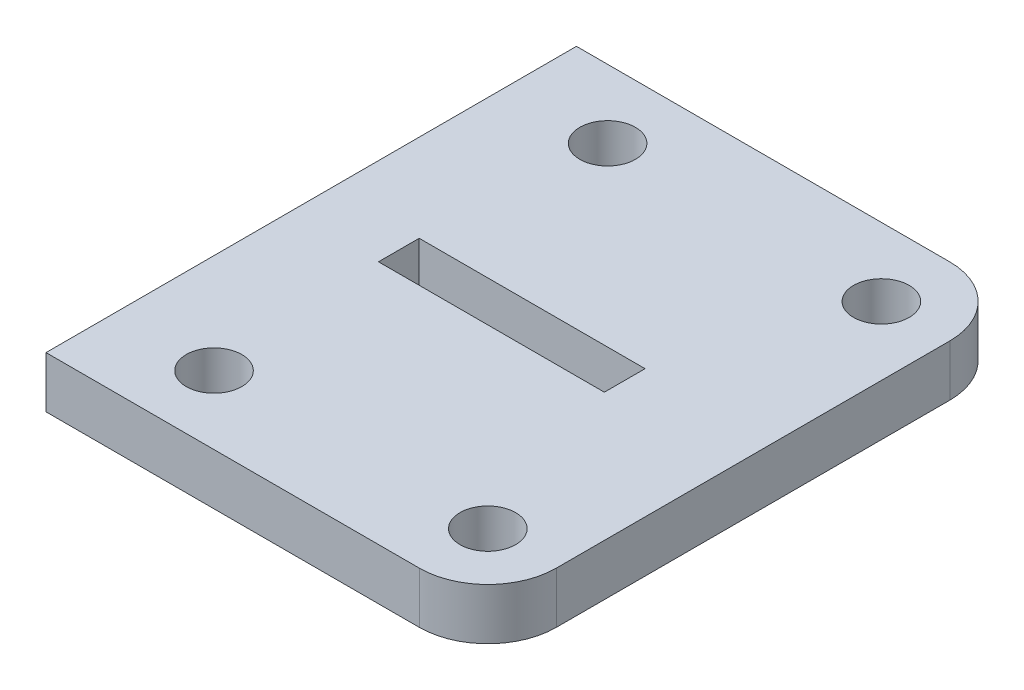
ISO-10303-21;
HEADER;
FILE_DESCRIPTION(('STEP AP214'),'2;1');
FILE_NAME('part.step','',(''),(''),'','','');
FILE_SCHEMA(('AUTOMOTIVE_DESIGN { 1 0 10303 214 1 1 1 1 }'));
ENDSEC;
DATA;
#1=APPLICATION_CONTEXT('core data for automotive mechanical design processes');
#2=APPLICATION_PROTOCOL_DEFINITION('international standard','automotive_design',2000,#1);
#3=PRODUCT_CONTEXT('',#1,'mechanical');
#4=PRODUCT('Part','Part','',(#3));
#5=PRODUCT_RELATED_PRODUCT_CATEGORY('part','',(#4));
#6=PRODUCT_DEFINITION_FORMATION('','',#4);
#7=PRODUCT_DEFINITION_CONTEXT('part definition',#1,'design');
#8=PRODUCT_DEFINITION('design','',#6,#7);
#9=PRODUCT_DEFINITION_SHAPE('','',#8);
#10=(LENGTH_UNIT() NAMED_UNIT(*) SI_UNIT(.MILLI.,.METRE.));
#11=(NAMED_UNIT(*) PLANE_ANGLE_UNIT() SI_UNIT($,.RADIAN.));
#12=(NAMED_UNIT(*) SI_UNIT($,.STERADIAN.) SOLID_ANGLE_UNIT());
#13=UNCERTAINTY_MEASURE_WITH_UNIT(LENGTH_MEASURE(1.E-05),#10,'distance_accuracy_value','');
#14=(GEOMETRIC_REPRESENTATION_CONTEXT(3) GLOBAL_UNCERTAINTY_ASSIGNED_CONTEXT((#13)) GLOBAL_UNIT_ASSIGNED_CONTEXT((#10,
#11,#12)) REPRESENTATION_CONTEXT('',''));
#15=CARTESIAN_POINT('',(0.,0.,0.));
#16=DIRECTION('',(0.,0.,1.));
#17=DIRECTION('',(1.,0.,0.));
#18=AXIS2_PLACEMENT_3D('',#15,#16,#17);
#19=CARTESIAN_POINT('',(60.,0.,30.));
#20=DIRECTION('',(0.,1.,0.));
#21=DIRECTION('',(-1.,0.,0.));
#22=AXIS2_PLACEMENT_3D('',#19,#20,#21);
#23=PLANE('',#22);
#24=DIRECTION('',(-1.,0.,0.));
#25=VECTOR('',#24,1.);
#26=CARTESIAN_POINT('',(15.,0.,12.62));
#27=LINE('',#26,#25);
#28=CARTESIAN_POINT('',(41.4,0.,12.62));
#29=VERTEX_POINT('',#28);
#30=CARTESIAN_POINT('',(15.,0.,12.62));
#31=VERTEX_POINT('',#30);
#32=EDGE_CURVE('E184',#29,#31,#27,.T.);
#33=ORIENTED_EDGE('',*,*,#32,.T.);
#34=DIRECTION('',(0.,0.,1.));
#35=VECTOR('',#34,1.);
#36=CARTESIAN_POINT('',(15.,0.,12.62));
#37=LINE('',#36,#35);
#38=CARTESIAN_POINT('',(15.,0.,17.38));
#39=VERTEX_POINT('',#38);
#40=EDGE_CURVE('E173',#31,#39,#37,.T.);
#41=ORIENTED_EDGE('',*,*,#40,.T.);
#42=DIRECTION('',(1.,0.,0.));
#43=VECTOR('',#42,1.);
#44=CARTESIAN_POINT('',(15.,0.,17.38));
#45=LINE('',#44,#43);
#46=CARTESIAN_POINT('',(41.4,0.,17.38));
#47=VERTEX_POINT('',#46);
#48=EDGE_CURVE('E177',#39,#47,#45,.T.);
#49=ORIENTED_EDGE('',*,*,#48,.T.);
#50=DIRECTION('',(0.,0.,-1.));
#51=VECTOR('',#50,1.);
#52=CARTESIAN_POINT('',(41.4,0.,12.62));
#53=LINE('',#52,#51);
#54=EDGE_CURVE('E69',#47,#29,#53,.T.);
#55=ORIENTED_EDGE('',*,*,#54,.T.);
#56=EDGE_LOOP('',(#33,#41,#49,#55));
#57=FACE_BOUND('',#56,.T.);
#58=CARTESIAN_POINT('',(16.4,0.,-8.));
#59=DIRECTION('',(0.,1.,0.));
#60=DIRECTION('',(0.,0.,1.));
#61=AXIS2_PLACEMENT_3D('',#58,#59,#60);
#62=CIRCLE('',#61,3.25);
#63=CARTESIAN_POINT('',(16.4,0.,-4.75));
#64=VERTEX_POINT('',#63);
#65=EDGE_CURVE('E206',#64,#64,#62,.T.);
#66=ORIENTED_EDGE('',*,*,#65,.T.);
#67=EDGE_LOOP('',(#66));
#68=FACE_BOUND('',#67,.T.);
#69=CARTESIAN_POINT('',(16.4,0.,38.));
#70=DIRECTION('',(0.,1.,0.));
#71=DIRECTION('',(0.,0.,1.));
#72=AXIS2_PLACEMENT_3D('',#69,#70,#71);
#73=CIRCLE('',#72,3.25);
#74=CARTESIAN_POINT('',(16.4,0.,41.25));
#75=VERTEX_POINT('',#74);
#76=EDGE_CURVE('E232',#75,#75,#73,.T.);
#77=ORIENTED_EDGE('',*,*,#76,.T.);
#78=EDGE_LOOP('',(#77));
#79=FACE_BOUND('',#78,.T.);
#80=CARTESIAN_POINT('',(48.4,0.,38.));
#81=DIRECTION('',(0.,1.,0.));
#82=DIRECTION('',(0.,0.,1.));
#83=AXIS2_PLACEMENT_3D('',#80,#81,#82);
#84=CIRCLE('',#83,3.25);
#85=CARTESIAN_POINT('',(48.4,0.,41.25));
#86=VERTEX_POINT('',#85);
#87=EDGE_CURVE('E221',#86,#86,#84,.T.);
#88=ORIENTED_EDGE('',*,*,#87,.T.);
#89=EDGE_LOOP('',(#88));
#90=FACE_BOUND('',#89,.T.);
#91=CARTESIAN_POINT('',(48.4,0.,-8.));
#92=DIRECTION('',(0.,1.,0.));
#93=DIRECTION('',(0.,0.,1.));
#94=AXIS2_PLACEMENT_3D('',#91,#92,#93);
#95=CIRCLE('',#94,3.25);
#96=CARTESIAN_POINT('',(48.4,0.,-4.75));
#97=VERTEX_POINT('',#96);
#98=EDGE_CURVE('E145',#97,#97,#95,.T.);
#99=ORIENTED_EDGE('',*,*,#98,.T.);
#100=EDGE_LOOP('',(#99));
#101=FACE_BOUND('',#100,.T.);
#102=DIRECTION('',(1.,0.,0.));
#103=VECTOR('',#102,1.);
#104=CARTESIAN_POINT('',(56.4,0.,46.));
#105=LINE('',#104,#103);
#106=CARTESIAN_POINT('',(4.76,0.,46.));
#107=VERTEX_POINT('',#106);
#108=CARTESIAN_POINT('',(48.4,0.,46.));
#109=VERTEX_POINT('',#108);
#110=EDGE_CURVE('E136',#107,#109,#105,.T.);
#111=ORIENTED_EDGE('',*,*,#110,.F.);
#112=DIRECTION('',(0.,0.,-1.));
#113=VECTOR('',#112,1.);
#114=CARTESIAN_POINT('',(4.75999999999999,0.,-16.));
#115=LINE('',#114,#113);
#116=CARTESIAN_POINT('',(4.75999999999999,0.,-16.));
#117=VERTEX_POINT('',#116);
#118=EDGE_CURVE('E123',#107,#117,#115,.T.);
#119=ORIENTED_EDGE('',*,*,#118,.T.);
#120=DIRECTION('',(-1.,0.,0.));
#121=VECTOR('',#120,1.);
#122=CARTESIAN_POINT('',(56.4,0.,-16.));
#123=LINE('',#122,#121);
#124=CARTESIAN_POINT('',(48.4,0.,-16.));
#125=VERTEX_POINT('',#124);
#126=EDGE_CURVE('E134',#125,#117,#123,.T.);
#127=ORIENTED_EDGE('',*,*,#126,.F.);
#128=CARTESIAN_POINT('',(48.4,0.,-8.));
#129=DIRECTION('',(0.,1.,0.));
#130=DIRECTION('',(-1.,0.,0.));
#131=AXIS2_PLACEMENT_3D('',#128,#129,#130);
#132=CIRCLE('',#131,8.);
#133=CARTESIAN_POINT('',(56.4,0.,-8.));
#134=VERTEX_POINT('',#133);
#135=EDGE_CURVE('E320',#125,#134,#132,.F.);
#136=ORIENTED_EDGE('',*,*,#135,.T.);
#137=DIRECTION('',(0.,0.,1.));
#138=VECTOR('',#137,1.);
#139=CARTESIAN_POINT('',(56.4,0.,0.));
#140=LINE('',#139,#138);
#141=CARTESIAN_POINT('',(56.4,0.,38.));
#142=VERTEX_POINT('',#141);
#143=EDGE_CURVE('E328',#134,#142,#140,.T.);
#144=ORIENTED_EDGE('',*,*,#143,.T.);
#145=CARTESIAN_POINT('',(48.4,0.,38.));
#146=DIRECTION('',(0.,1.,0.));
#147=DIRECTION('',(-1.,0.,0.));
#148=AXIS2_PLACEMENT_3D('',#145,#146,#147);
#149=CIRCLE('',#148,8.);
#150=EDGE_CURVE('E323',#142,#109,#149,.F.);
#151=ORIENTED_EDGE('',*,*,#150,.T.);
#152=EDGE_LOOP('',(#111,#119,#127,#136,#144,#151));
#153=FACE_BOUND('',#152,.T.);
#154=ADVANCED_FACE('F45',(#57,#68,#79,#90,#101,#153),#23,.F.);
#155=CARTESIAN_POINT('',(60.,6.,18.));
#156=DIRECTION('',(0.,-1.,0.));
#157=DIRECTION('',(0.,0.,-1.));
#158=AXIS2_PLACEMENT_3D('',#155,#156,#157);
#159=PLANE('',#158);
#160=DIRECTION('',(1.,0.,0.));
#161=VECTOR('',#160,1.);
#162=CARTESIAN_POINT('',(15.,6.,17.38));
#163=LINE('',#162,#161);
#164=CARTESIAN_POINT('',(15.,6.,17.38));
#165=VERTEX_POINT('',#164);
#166=CARTESIAN_POINT('',(41.4,6.,17.38));
#167=VERTEX_POINT('',#166);
#168=EDGE_CURVE('E192',#165,#167,#163,.T.);
#169=ORIENTED_EDGE('',*,*,#168,.F.);
#170=DIRECTION('',(0.,0.,1.));
#171=VECTOR('',#170,1.);
#172=CARTESIAN_POINT('',(15.,6.,12.62));
#173=LINE('',#172,#171);
#174=CARTESIAN_POINT('',(15.,6.,12.62));
#175=VERTEX_POINT('',#174);
#176=EDGE_CURVE('E171',#175,#165,#173,.T.);
#177=ORIENTED_EDGE('',*,*,#176,.F.);
#178=DIRECTION('',(-1.,0.,0.));
#179=VECTOR('',#178,1.);
#180=CARTESIAN_POINT('',(15.,6.,12.62));
#181=LINE('',#180,#179);
#182=CARTESIAN_POINT('',(41.4,6.,12.62));
#183=VERTEX_POINT('',#182);
#184=EDGE_CURVE('E178',#183,#175,#181,.T.);
#185=ORIENTED_EDGE('',*,*,#184,.F.);
#186=DIRECTION('',(0.,0.,-1.));
#187=VECTOR('',#186,1.);
#188=CARTESIAN_POINT('',(41.4,6.,12.62));
#189=LINE('',#188,#187);
#190=EDGE_CURVE('E201',#167,#183,#189,.T.);
#191=ORIENTED_EDGE('',*,*,#190,.F.);
#192=EDGE_LOOP('',(#169,#177,#185,#191));
#193=FACE_BOUND('',#192,.T.);
#194=DIRECTION('',(1.,0.,0.));
#195=VECTOR('',#194,1.);
#196=CARTESIAN_POINT('',(56.4,6.,-16.));
#197=LINE('',#196,#195);
#198=CARTESIAN_POINT('',(4.76,6.,-16.));
#199=VERTEX_POINT('',#198);
#200=CARTESIAN_POINT('',(48.4,6.,-16.));
#201=VERTEX_POINT('',#200);
#202=EDGE_CURVE('E144',#199,#201,#197,.T.);
#203=ORIENTED_EDGE('',*,*,#202,.F.);
#204=DIRECTION('',(0.,0.,-1.));
#205=VECTOR('',#204,1.);
#206=CARTESIAN_POINT('',(4.75999999999999,6.,-16.));
#207=LINE('',#206,#205);
#208=CARTESIAN_POINT('',(4.76,6.,46.));
#209=VERTEX_POINT('',#208);
#210=EDGE_CURVE('E61',#209,#199,#207,.T.);
#211=ORIENTED_EDGE('',*,*,#210,.F.);
#212=DIRECTION('',(-1.,0.,0.));
#213=VECTOR('',#212,1.);
#214=CARTESIAN_POINT('',(56.4,6.,46.));
#215=LINE('',#214,#213);
#216=CARTESIAN_POINT('',(48.4,6.,46.));
#217=VERTEX_POINT('',#216);
#218=EDGE_CURVE('E149',#217,#209,#215,.T.);
#219=ORIENTED_EDGE('',*,*,#218,.F.);
#220=CARTESIAN_POINT('',(48.4,6.,38.));
#221=DIRECTION('',(0.,-1.,0.));
#222=DIRECTION('',(0.,0.,-1.));
#223=AXIS2_PLACEMENT_3D('',#220,#221,#222);
#224=CIRCLE('',#223,8.);
#225=CARTESIAN_POINT('',(56.4,6.00000000000001,38.));
#226=VERTEX_POINT('',#225);
#227=EDGE_CURVE('E12',#217,#226,#224,.F.);
#228=ORIENTED_EDGE('',*,*,#227,.T.);
#229=DIRECTION('',(0.,0.,1.));
#230=VECTOR('',#229,1.);
#231=CARTESIAN_POINT('',(56.4,6.,0.));
#232=LINE('',#231,#230);
#233=CARTESIAN_POINT('',(56.4,5.99999999999999,-8.));
#234=VERTEX_POINT('',#233);
#235=EDGE_CURVE('E329',#234,#226,#232,.T.);
#236=ORIENTED_EDGE('',*,*,#235,.F.);
#237=CARTESIAN_POINT('',(48.4,6.,-8.));
#238=DIRECTION('',(0.,-1.,0.));
#239=DIRECTION('',(0.,0.,-1.));
#240=AXIS2_PLACEMENT_3D('',#237,#238,#239);
#241=CIRCLE('',#240,8.);
#242=EDGE_CURVE('E306',#234,#201,#241,.F.);
#243=ORIENTED_EDGE('',*,*,#242,.T.);
#244=EDGE_LOOP('',(#203,#211,#219,#228,#236,#243));
#245=FACE_BOUND('',#244,.T.);
#246=CARTESIAN_POINT('',(16.4,6.,38.));
#247=DIRECTION('',(0.,1.,0.));
#248=DIRECTION('',(0.,0.,1.));
#249=AXIS2_PLACEMENT_3D('',#246,#247,#248);
#250=CIRCLE('',#249,3.25);
#251=CARTESIAN_POINT('',(16.4,6.,41.25));
#252=VERTEX_POINT('',#251);
#253=EDGE_CURVE('E260',#252,#252,#250,.T.);
#254=ORIENTED_EDGE('',*,*,#253,.F.);
#255=EDGE_LOOP('',(#254));
#256=FACE_BOUND('',#255,.T.);
#257=CARTESIAN_POINT('',(48.4,6.,38.));
#258=DIRECTION('',(0.,1.,0.));
#259=DIRECTION('',(0.,0.,1.));
#260=AXIS2_PLACEMENT_3D('',#257,#258,#259);
#261=CIRCLE('',#260,3.25);
#262=CARTESIAN_POINT('',(48.4,6.,41.25));
#263=VERTEX_POINT('',#262);
#264=EDGE_CURVE('E216',#263,#263,#261,.T.);
#265=ORIENTED_EDGE('',*,*,#264,.F.);
#266=EDGE_LOOP('',(#265));
#267=FACE_BOUND('',#266,.T.);
#268=CARTESIAN_POINT('',(16.4,6.,-8.));
#269=DIRECTION('',(0.,1.,0.));
#270=DIRECTION('',(0.,0.,1.));
#271=AXIS2_PLACEMENT_3D('',#268,#269,#270);
#272=CIRCLE('',#271,3.25);
#273=CARTESIAN_POINT('',(16.4,6.,-4.75));
#274=VERTEX_POINT('',#273);
#275=EDGE_CURVE('E226',#274,#274,#272,.T.);
#276=ORIENTED_EDGE('',*,*,#275,.F.);
#277=EDGE_LOOP('',(#276));
#278=FACE_BOUND('',#277,.T.);
#279=CARTESIAN_POINT('',(48.4,6.,-8.));
#280=DIRECTION('',(0.,1.,0.));
#281=DIRECTION('',(0.,0.,1.));
#282=AXIS2_PLACEMENT_3D('',#279,#280,#281);
#283=CIRCLE('',#282,3.25);
#284=CARTESIAN_POINT('',(48.4,6.,-4.75));
#285=VERTEX_POINT('',#284);
#286=EDGE_CURVE('E152',#285,#285,#283,.T.);
#287=ORIENTED_EDGE('',*,*,#286,.F.);
#288=EDGE_LOOP('',(#287));
#289=FACE_BOUND('',#288,.T.);
#290=ADVANCED_FACE('F247',(#193,#245,#256,#267,#278,#289),#159,.F.);
#291=CARTESIAN_POINT('',(56.4,0.,0.));
#292=DIRECTION('',(-1.,0.,0.));
#293=DIRECTION('',(0.,0.,1.));
#294=AXIS2_PLACEMENT_3D('',#291,#292,#293);
#295=PLANE('',#294);
#296=ORIENTED_EDGE('',*,*,#143,.F.);
#297=DIRECTION('',(0.,-1.,0.));
#298=VECTOR('',#297,1.);
#299=CARTESIAN_POINT('',(56.4,6.,-8.));
#300=LINE('',#299,#298);
#301=EDGE_CURVE('E308',#134,#234,#300,.F.);
#302=ORIENTED_EDGE('',*,*,#301,.T.);
#303=ORIENTED_EDGE('',*,*,#235,.T.);
#304=DIRECTION('',(0.,1.,0.));
#305=VECTOR('',#304,1.);
#306=CARTESIAN_POINT('',(56.4,0.,38.));
#307=LINE('',#306,#305);
#308=EDGE_CURVE('E315',#226,#142,#307,.F.);
#309=ORIENTED_EDGE('',*,*,#308,.T.);
#310=EDGE_LOOP('',(#296,#302,#303,#309));
#311=FACE_BOUND('',#310,.T.);
#312=ADVANCED_FACE('F250',(#311),#295,.F.);
#313=CARTESIAN_POINT('',(0.,0.,46.));
#314=DIRECTION('',(0.,0.,-1.));
#315=DIRECTION('',(-1.,0.,0.));
#316=AXIS2_PLACEMENT_3D('',#313,#314,#315);
#317=PLANE('',#316);
#318=ORIENTED_EDGE('',*,*,#218,.T.);
#319=DIRECTION('',(0.,1.,0.));
#320=VECTOR('',#319,1.);
#321=CARTESIAN_POINT('',(4.76,0.,46.));
#322=LINE('',#321,#320);
#323=EDGE_CURVE('E129',#107,#209,#322,.T.);
#324=ORIENTED_EDGE('',*,*,#323,.F.);
#325=ORIENTED_EDGE('',*,*,#110,.T.);
#326=DIRECTION('',(0.,1.,0.));
#327=VECTOR('',#326,1.);
#328=CARTESIAN_POINT('',(48.4,0.,46.));
#329=LINE('',#328,#327);
#330=EDGE_CURVE('E54',#109,#217,#329,.T.);
#331=ORIENTED_EDGE('',*,*,#330,.T.);
#332=EDGE_LOOP('',(#318,#324,#325,#331));
#333=FACE_BOUND('',#332,.T.);
#334=ADVANCED_FACE('F301',(#333),#317,.F.);
#335=CARTESIAN_POINT('',(0.,0.,-16.));
#336=DIRECTION('',(0.,0.,-1.));
#337=DIRECTION('',(-1.,0.,0.));
#338=AXIS2_PLACEMENT_3D('',#335,#336,#337);
#339=PLANE('',#338);
#340=DIRECTION('',(0.,1.,0.));
#341=VECTOR('',#340,1.);
#342=CARTESIAN_POINT('',(4.75999999999999,0.,-16.));
#343=LINE('',#342,#341);
#344=EDGE_CURVE('E120',#117,#199,#343,.T.);
#345=ORIENTED_EDGE('',*,*,#344,.T.);
#346=ORIENTED_EDGE('',*,*,#202,.T.);
#347=DIRECTION('',(0.,-1.,0.));
#348=VECTOR('',#347,1.);
#349=CARTESIAN_POINT('',(48.4,0.,-16.));
#350=LINE('',#349,#348);
#351=EDGE_CURVE('E142',#201,#125,#350,.T.);
#352=ORIENTED_EDGE('',*,*,#351,.T.);
#353=ORIENTED_EDGE('',*,*,#126,.T.);
#354=EDGE_LOOP('',(#345,#346,#352,#353));
#355=FACE_BOUND('',#354,.T.);
#356=ADVANCED_FACE('F140',(#355),#339,.T.);
#357=CARTESIAN_POINT('',(48.4,0.,-8.));
#358=DIRECTION('',(0.,1.,0.));
#359=DIRECTION('',(0.,0.,1.));
#360=AXIS2_PLACEMENT_3D('',#357,#358,#359);
#361=CYLINDRICAL_SURFACE('',#360,8.);
#362=ORIENTED_EDGE('',*,*,#242,.F.);
#363=ORIENTED_EDGE('',*,*,#301,.F.);
#364=ORIENTED_EDGE('',*,*,#135,.F.);
#365=ORIENTED_EDGE('',*,*,#351,.F.);
#366=EDGE_LOOP('',(#362,#363,#364,#365));
#367=FACE_BOUND('',#366,.T.);
#368=ADVANCED_FACE('F283',(#367),#361,.T.);
#369=CARTESIAN_POINT('',(48.4,0.,38.));
#370=DIRECTION('',(0.,1.,0.));
#371=DIRECTION('',(0.,0.,1.));
#372=AXIS2_PLACEMENT_3D('',#369,#370,#371);
#373=CYLINDRICAL_SURFACE('',#372,8.);
#374=ORIENTED_EDGE('',*,*,#150,.F.);
#375=ORIENTED_EDGE('',*,*,#308,.F.);
#376=ORIENTED_EDGE('',*,*,#227,.F.);
#377=ORIENTED_EDGE('',*,*,#330,.F.);
#378=EDGE_LOOP('',(#374,#375,#376,#377));
#379=FACE_BOUND('',#378,.T.);
#380=ADVANCED_FACE('F47',(#379),#373,.T.);
#381=CARTESIAN_POINT('',(48.4,0.,38.));
#382=DIRECTION('',(0.,1.,0.));
#383=DIRECTION('',(0.,0.,1.));
#384=AXIS2_PLACEMENT_3D('',#381,#382,#383);
#385=CYLINDRICAL_SURFACE('',#384,3.25);
#386=ORIENTED_EDGE('',*,*,#87,.F.);
#387=EDGE_LOOP('',(#386));
#388=FACE_BOUND('',#387,.T.);
#389=ORIENTED_EDGE('',*,*,#264,.T.);
#390=EDGE_LOOP('',(#389));
#391=FACE_BOUND('',#390,.T.);
#392=ADVANCED_FACE('F270',(#388,#391),#385,.F.);
#393=CARTESIAN_POINT('',(16.4,0.,38.));
#394=DIRECTION('',(0.,1.,0.));
#395=DIRECTION('',(0.,0.,1.));
#396=AXIS2_PLACEMENT_3D('',#393,#394,#395);
#397=CYLINDRICAL_SURFACE('',#396,3.25);
#398=ORIENTED_EDGE('',*,*,#76,.F.);
#399=EDGE_LOOP('',(#398));
#400=FACE_BOUND('',#399,.T.);
#401=ORIENTED_EDGE('',*,*,#253,.T.);
#402=EDGE_LOOP('',(#401));
#403=FACE_BOUND('',#402,.T.);
#404=ADVANCED_FACE('F267',(#400,#403),#397,.F.);
#405=CARTESIAN_POINT('',(48.4,0.,-8.));
#406=DIRECTION('',(0.,1.,0.));
#407=DIRECTION('',(0.,0.,1.));
#408=AXIS2_PLACEMENT_3D('',#405,#406,#407);
#409=CYLINDRICAL_SURFACE('',#408,3.25);
#410=ORIENTED_EDGE('',*,*,#98,.F.);
#411=EDGE_LOOP('',(#410));
#412=FACE_BOUND('',#411,.T.);
#413=ORIENTED_EDGE('',*,*,#286,.T.);
#414=EDGE_LOOP('',(#413));
#415=FACE_BOUND('',#414,.T.);
#416=ADVANCED_FACE('F243',(#412,#415),#409,.F.);
#417=CARTESIAN_POINT('',(16.4,0.,-8.));
#418=DIRECTION('',(0.,1.,0.));
#419=DIRECTION('',(0.,0.,1.));
#420=AXIS2_PLACEMENT_3D('',#417,#418,#419);
#421=CYLINDRICAL_SURFACE('',#420,3.25);
#422=ORIENTED_EDGE('',*,*,#65,.F.);
#423=EDGE_LOOP('',(#422));
#424=FACE_BOUND('',#423,.T.);
#425=ORIENTED_EDGE('',*,*,#275,.T.);
#426=EDGE_LOOP('',(#425));
#427=FACE_BOUND('',#426,.T.);
#428=ADVANCED_FACE('F239',(#424,#427),#421,.F.);
#429=CARTESIAN_POINT('',(15.,0.,12.62));
#430=DIRECTION('',(-1.,0.,0.));
#431=DIRECTION('',(0.,0.,1.));
#432=AXIS2_PLACEMENT_3D('',#429,#430,#431);
#433=PLANE('',#432);
#434=ORIENTED_EDGE('',*,*,#176,.T.);
#435=DIRECTION('',(0.,1.,0.));
#436=VECTOR('',#435,1.);
#437=CARTESIAN_POINT('',(15.,0.,17.38));
#438=LINE('',#437,#436);
#439=EDGE_CURVE('E188',#39,#165,#438,.T.);
#440=ORIENTED_EDGE('',*,*,#439,.F.);
#441=ORIENTED_EDGE('',*,*,#40,.F.);
#442=DIRECTION('',(0.,1.,0.));
#443=VECTOR('',#442,1.);
#444=CARTESIAN_POINT('',(15.,0.,12.62));
#445=LINE('',#444,#443);
#446=EDGE_CURVE('E203',#31,#175,#445,.T.);
#447=ORIENTED_EDGE('',*,*,#446,.T.);
#448=EDGE_LOOP('',(#434,#440,#441,#447));
#449=FACE_BOUND('',#448,.T.);
#450=ADVANCED_FACE('F242',(#449),#433,.F.);
#451=CARTESIAN_POINT('',(15.,0.,12.62));
#452=DIRECTION('',(0.,0.,-1.));
#453=DIRECTION('',(0.,1.,0.));
#454=AXIS2_PLACEMENT_3D('',#451,#452,#453);
#455=PLANE('',#454);
#456=ORIENTED_EDGE('',*,*,#184,.T.);
#457=ORIENTED_EDGE('',*,*,#446,.F.);
#458=ORIENTED_EDGE('',*,*,#32,.F.);
#459=DIRECTION('',(0.,1.,0.));
#460=VECTOR('',#459,1.);
#461=CARTESIAN_POINT('',(41.4,0.,12.62));
#462=LINE('',#461,#460);
#463=EDGE_CURVE('E207',#29,#183,#462,.T.);
#464=ORIENTED_EDGE('',*,*,#463,.T.);
#465=EDGE_LOOP('',(#456,#457,#458,#464));
#466=FACE_BOUND('',#465,.T.);
#467=ADVANCED_FACE('F372',(#466),#455,.F.);
#468=CARTESIAN_POINT('',(41.4,0.,12.62));
#469=DIRECTION('',(1.,0.,0.));
#470=DIRECTION('',(0.,0.,-1.));
#471=AXIS2_PLACEMENT_3D('',#468,#469,#470);
#472=PLANE('',#471);
#473=ORIENTED_EDGE('',*,*,#190,.T.);
#474=ORIENTED_EDGE('',*,*,#463,.F.);
#475=ORIENTED_EDGE('',*,*,#54,.F.);
#476=DIRECTION('',(0.,1.,0.));
#477=VECTOR('',#476,1.);
#478=CARTESIAN_POINT('',(41.4,0.,17.38));
#479=LINE('',#478,#477);
#480=EDGE_CURVE('E210',#47,#167,#479,.T.);
#481=ORIENTED_EDGE('',*,*,#480,.T.);
#482=EDGE_LOOP('',(#473,#474,#475,#481));
#483=FACE_BOUND('',#482,.T.);
#484=ADVANCED_FACE('F379',(#483),#472,.F.);
#485=CARTESIAN_POINT('',(15.,0.,17.38));
#486=DIRECTION('',(0.,0.,1.));
#487=DIRECTION('',(0.,-1.,0.));
#488=AXIS2_PLACEMENT_3D('',#485,#486,#487);
#489=PLANE('',#488);
#490=ORIENTED_EDGE('',*,*,#168,.T.);
#491=ORIENTED_EDGE('',*,*,#480,.F.);
#492=ORIENTED_EDGE('',*,*,#48,.F.);
#493=ORIENTED_EDGE('',*,*,#439,.T.);
#494=EDGE_LOOP('',(#490,#491,#492,#493));
#495=FACE_BOUND('',#494,.T.);
#496=ADVANCED_FACE('F387',(#495),#489,.F.);
#497=CARTESIAN_POINT('',(4.75999999999999,0.,-16.));
#498=DIRECTION('',(1.,0.,0.));
#499=DIRECTION('',(0.,0.,-1.));
#500=AXIS2_PLACEMENT_3D('',#497,#498,#499);
#501=PLANE('',#500);
#502=ORIENTED_EDGE('',*,*,#210,.T.);
#503=ORIENTED_EDGE('',*,*,#344,.F.);
#504=ORIENTED_EDGE('',*,*,#118,.F.);
#505=ORIENTED_EDGE('',*,*,#323,.T.);
#506=EDGE_LOOP('',(#502,#503,#504,#505));
#507=FACE_BOUND('',#506,.T.);
#508=ADVANCED_FACE('F122',(#507),#501,.F.);
#509=CLOSED_SHELL('',(#154,#290,#312,#334,#356,#368,#380,#392,#404,#416,#428,#450,#467,#484,
#496,#508));
#510=MANIFOLD_SOLID_BREP('B2',#509);
#511=ADVANCED_BREP_SHAPE_REPRESENTATION('',(#18,#510),#14);
#512=SHAPE_DEFINITION_REPRESENTATION(#9,#511);
ENDSEC;
END-ISO-10303-21;
